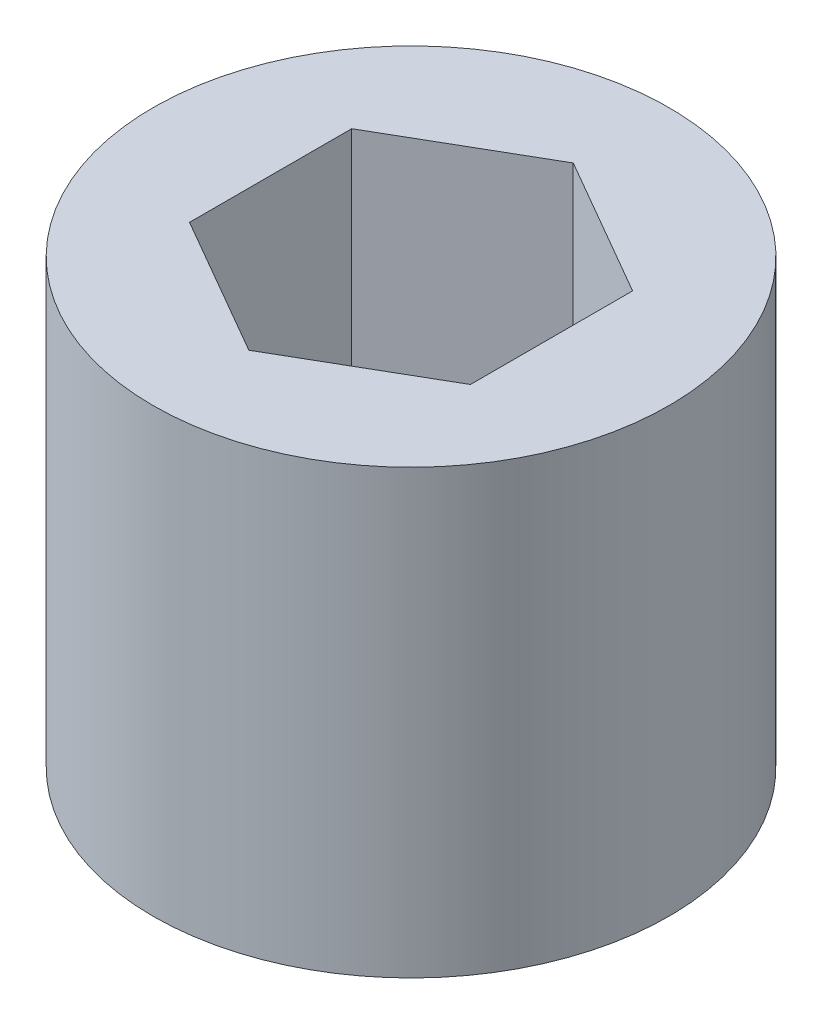
ISO-10303-21;
HEADER;
FILE_DESCRIPTION(('STEP AP214'),'2;1');
FILE_NAME('part.step','',(''),(''),'','','');
FILE_SCHEMA(('AUTOMOTIVE_DESIGN { 1 0 10303 214 1 1 1 1 }'));
ENDSEC;
DATA;
#1=APPLICATION_CONTEXT('core data for automotive mechanical design processes');
#2=APPLICATION_PROTOCOL_DEFINITION('international standard','automotive_design',2000,#1);
#3=PRODUCT_CONTEXT('',#1,'mechanical');
#4=PRODUCT('Part','Part','',(#3));
#5=PRODUCT_RELATED_PRODUCT_CATEGORY('part','',(#4));
#6=PRODUCT_DEFINITION_FORMATION('','',#4);
#7=PRODUCT_DEFINITION_CONTEXT('part definition',#1,'design');
#8=PRODUCT_DEFINITION('design','',#6,#7);
#9=PRODUCT_DEFINITION_SHAPE('','',#8);
#10=(LENGTH_UNIT() NAMED_UNIT(*) SI_UNIT(.MILLI.,.METRE.));
#11=(NAMED_UNIT(*) PLANE_ANGLE_UNIT() SI_UNIT($,.RADIAN.));
#12=(NAMED_UNIT(*) SI_UNIT($,.STERADIAN.) SOLID_ANGLE_UNIT());
#13=UNCERTAINTY_MEASURE_WITH_UNIT(LENGTH_MEASURE(1.E-05),#10,'distance_accuracy_value','');
#14=(GEOMETRIC_REPRESENTATION_CONTEXT(3) GLOBAL_UNCERTAINTY_ASSIGNED_CONTEXT((#13)) GLOBAL_UNIT_ASSIGNED_CONTEXT((#10,
#11,#12)) REPRESENTATION_CONTEXT('',''));
#15=CARTESIAN_POINT('',(0.,0.,0.));
#16=DIRECTION('',(0.,0.,1.));
#17=DIRECTION('',(1.,0.,0.));
#18=AXIS2_PLACEMENT_3D('',#15,#16,#17);
#19=CARTESIAN_POINT('',(0.,2.032,0.));
#20=DIRECTION('',(0.,1.,0.));
#21=DIRECTION('',(0.,0.,1.));
#22=AXIS2_PLACEMENT_3D('',#19,#20,#21);
#23=PLANE('',#22);
#24=DIRECTION('',(0.,0.,1.));
#25=VECTOR('',#24,1.);
#26=CARTESIAN_POINT('',(2.16567497817377,2.032,-16.034004));
#27=LINE('',#26,#25);
#28=CARTESIAN_POINT('',(2.16567497817377,2.032,1.25035303162645));
#29=VERTEX_POINT('',#28);
#30=CARTESIAN_POINT('',(2.1656749781745,2.032,-1.25035303162447));
#31=VERTEX_POINT('',#30);
#32=EDGE_CURVE('E84',#29,#31,#27,.F.);
#33=ORIENTED_EDGE('',*,*,#32,.T.);
#34=DIRECTION('',(0.866025403784429,0.,0.500000000000017));
#35=VECTOR('',#34,1.);
#36=CARTESIAN_POINT('',(-16.0340039999993,2.032,-11.7579425888392));
#37=LINE('',#36,#35);
#38=CARTESIAN_POINT('',(-1.34094124693007E-12,2.032,-2.50070606325096));
#39=VERTEX_POINT('',#38);
#40=EDGE_CURVE('E86',#31,#39,#37,.F.);
#41=ORIENTED_EDGE('',*,*,#40,.T.);
#42=DIRECTION('',(0.866025403784429,0.,-0.500000000000017));
#43=VECTOR('',#42,1.);
#44=CARTESIAN_POINT('',(-16.0340039999995,2.032,6.7565304623359));
#45=LINE('',#44,#43);
#46=CARTESIAN_POINT('',(-2.16567497817377,2.032,-1.25035303162645));
#47=VERTEX_POINT('',#46);
#48=EDGE_CURVE('E127',#39,#47,#45,.F.);
#49=ORIENTED_EDGE('',*,*,#48,.T.);
#50=DIRECTION('',(0.,0.,-1.));
#51=VECTOR('',#50,1.);
#52=CARTESIAN_POINT('',(-2.16567497817377,2.032,16.034004));
#53=LINE('',#52,#51);
#54=CARTESIAN_POINT('',(-2.16567497817377,2.032,1.25035303162502));
#55=VERTEX_POINT('',#54);
#56=EDGE_CURVE('E130',#47,#55,#53,.F.);
#57=ORIENTED_EDGE('',*,*,#56,.T.);
#58=DIRECTION('',(-0.866025403784429,0.,-0.500000000000017));
#59=VECTOR('',#58,1.);
#60=CARTESIAN_POINT('',(16.0340039999992,2.032,11.7579425888394));
#61=LINE('',#60,#59);
#62=CARTESIAN_POINT('',(2.61422827829705E-12,2.032,2.50070606325182));
#63=VERTEX_POINT('',#62);
#64=EDGE_CURVE('E108',#55,#63,#61,.F.);
#65=ORIENTED_EDGE('',*,*,#64,.T.);
#66=DIRECTION('',(-0.866025403784429,0.,0.500000000000017));
#67=VECTOR('',#66,1.);
#68=CARTESIAN_POINT('',(16.0340039999995,2.032,-6.7565304623359));
#69=LINE('',#68,#67);
#70=EDGE_CURVE('E89',#63,#29,#69,.F.);
#71=ORIENTED_EDGE('',*,*,#70,.T.);
#72=EDGE_LOOP('',(#33,#41,#49,#57,#65,#71));
#73=FACE_BOUND('',#72,.T.);
#74=ADVANCED_FACE('F16',(#73),#23,.T.);
#75=CARTESIAN_POINT('',(-16.034004,2.286,-11.7579425888379));
#76=DIRECTION('',(0.866025403784429,0.,0.500000000000017));
#77=DIRECTION('',(0.500000000000017,0.,-0.866025403784429));
#78=AXIS2_PLACEMENT_3D('',#75,#76,#77);
#79=CYLINDRICAL_SURFACE('',#78,0.254);
#80=DIRECTION('',(-0.866025403784429,0.,-0.500000000000017));
#81=VECTOR('',#80,1.);
#82=CARTESIAN_POINT('',(2.41967497817377,2.286,-1.397));
#83=LINE('',#82,#81);
#84=CARTESIAN_POINT('',(2.41967497817454,2.286,-1.39699999999955));
#85=VERTEX_POINT('',#84);
#86=CARTESIAN_POINT('',(-1.26878929640352E-12,2.286,-2.79400000000082));
#87=VERTEX_POINT('',#86);
#88=EDGE_CURVE('E115',#85,#87,#83,.T.);
#89=ORIENTED_EDGE('',*,*,#88,.T.);
#90=CARTESIAN_POINT('',(-2.61422827829705E-12,2.286,-2.50070606325148));
#91=DIRECTION('',(1.,0.,0.));
#92=DIRECTION('',(0.,0.,-1.));
#93=AXIS2_PLACEMENT_3D('',#90,#91,#92);
#94=ELLIPSE('',#93,0.293293936748333,0.254);
#95=EDGE_CURVE('E99',#87,#39,#94,.F.);
#96=ORIENTED_EDGE('',*,*,#95,.T.);
#97=ORIENTED_EDGE('',*,*,#40,.F.);
#98=CARTESIAN_POINT('',(2.16567497817377,2.286,-1.25035303162405));
#99=DIRECTION('',(0.499999999999992,0.,0.866025403784443));
#100=DIRECTION('',(0.866025403784444,0.,-0.499999999999992));
#101=AXIS2_PLACEMENT_3D('',#98,#99,#100);
#102=ELLIPSE('',#101,0.293293936748328,0.254);
#103=EDGE_CURVE('E19',#31,#85,#102,.T.);
#104=ORIENTED_EDGE('',*,*,#103,.T.);
#105=EDGE_LOOP('',(#89,#96,#97,#104));
#106=FACE_BOUND('',#105,.T.);
#107=ADVANCED_FACE('F96',(#106),#79,.F.);
#108=CARTESIAN_POINT('',(2.16567497817377,2.286,-16.034004));
#109=DIRECTION('',(0.,0.,1.));
#110=DIRECTION('',(1.,0.,0.));
#111=AXIS2_PLACEMENT_3D('',#108,#109,#110);
#112=CYLINDRICAL_SURFACE('',#111,0.254);
#113=ORIENTED_EDGE('',*,*,#32,.F.);
#114=CARTESIAN_POINT('',(2.16567497817377,2.286,1.25035303162707));
#115=DIRECTION('',(-0.499999999999992,0.,0.866025403784443));
#116=DIRECTION('',(-0.866025403784444,0.,-0.499999999999992));
#117=AXIS2_PLACEMENT_3D('',#114,#115,#116);
#118=ELLIPSE('',#117,0.293293936748328,0.254);
#119=CARTESIAN_POINT('',(2.41967497817319,2.286,1.3970000000009));
#120=VERTEX_POINT('',#119);
#121=EDGE_CURVE('E106',#29,#120,#118,.T.);
#122=ORIENTED_EDGE('',*,*,#121,.T.);
#123=DIRECTION('',(0.,0.,-1.));
#124=VECTOR('',#123,1.);
#125=CARTESIAN_POINT('',(2.41967497817377,2.286,1.397));
#126=LINE('',#125,#124);
#127=EDGE_CURVE('E104',#120,#85,#126,.T.);
#128=ORIENTED_EDGE('',*,*,#127,.T.);
#129=ORIENTED_EDGE('',*,*,#103,.F.);
#130=EDGE_LOOP('',(#113,#122,#128,#129));
#131=FACE_BOUND('',#130,.T.);
#132=ADVANCED_FACE('F102',(#131),#112,.F.);
#133=CARTESIAN_POINT('',(16.034004,2.286,-6.75653046233496));
#134=DIRECTION('',(-0.866025403784429,0.,0.500000000000017));
#135=DIRECTION('',(0.500000000000017,0.,0.866025403784429));
#136=AXIS2_PLACEMENT_3D('',#133,#134,#135);
#137=CYLINDRICAL_SURFACE('',#136,0.254);
#138=ORIENTED_EDGE('',*,*,#70,.F.);
#139=CARTESIAN_POINT('',(2.61422827829705E-12,2.286,2.50070606325148));
#140=DIRECTION('',(-1.,0.,0.));
#141=DIRECTION('',(0.,0.,1.));
#142=AXIS2_PLACEMENT_3D('',#139,#140,#141);
#143=ELLIPSE('',#142,0.293293936748333,0.254);
#144=CARTESIAN_POINT('',(1.26878929640352E-12,2.286,2.79400000000082));
#145=VERTEX_POINT('',#144);
#146=EDGE_CURVE('E131',#63,#145,#143,.T.);
#147=ORIENTED_EDGE('',*,*,#146,.T.);
#148=DIRECTION('',(0.866025403784429,0.,-0.500000000000017));
#149=VECTOR('',#148,1.);
#150=CARTESIAN_POINT('',(0.,2.286,2.794));
#151=LINE('',#150,#149);
#152=EDGE_CURVE('E118',#145,#120,#151,.T.);
#153=ORIENTED_EDGE('',*,*,#152,.T.);
#154=ORIENTED_EDGE('',*,*,#121,.F.);
#155=EDGE_LOOP('',(#138,#147,#153,#154));
#156=FACE_BOUND('',#155,.T.);
#157=ADVANCED_FACE('F143',(#156),#137,.F.);
#158=CARTESIAN_POINT('',(16.034004,2.286,11.7579425888379));
#159=DIRECTION('',(-0.866025403784429,0.,-0.500000000000017));
#160=DIRECTION('',(-0.500000000000017,0.,0.866025403784429));
#161=AXIS2_PLACEMENT_3D('',#158,#159,#160);
#162=CYLINDRICAL_SURFACE('',#161,0.254);
#163=ORIENTED_EDGE('',*,*,#64,.F.);
#164=CARTESIAN_POINT('',(-2.16567497817377,2.286,1.25035303162405));
#165=DIRECTION('',(-0.499999999999992,0.,-0.866025403784443));
#166=DIRECTION('',(-0.866025403784444,0.,0.499999999999992));
#167=AXIS2_PLACEMENT_3D('',#164,#165,#166);
#168=ELLIPSE('',#167,0.293293936748328,0.254);
#169=CARTESIAN_POINT('',(-2.41967497817454,2.286,1.39699999999955));
#170=VERTEX_POINT('',#169);
#171=EDGE_CURVE('E128',#55,#170,#168,.T.);
#172=ORIENTED_EDGE('',*,*,#171,.T.);
#173=DIRECTION('',(0.866025403784429,0.,0.500000000000017));
#174=VECTOR('',#173,1.);
#175=CARTESIAN_POINT('',(-2.41967497817377,2.286,1.397));
#176=LINE('',#175,#174);
#177=EDGE_CURVE('E117',#170,#145,#176,.T.);
#178=ORIENTED_EDGE('',*,*,#177,.T.);
#179=ORIENTED_EDGE('',*,*,#146,.F.);
#180=EDGE_LOOP('',(#163,#172,#178,#179));
#181=FACE_BOUND('',#180,.T.);
#182=ADVANCED_FACE('F185',(#181),#162,.F.);
#183=CARTESIAN_POINT('',(-2.16567497817377,2.286,16.034004));
#184=DIRECTION('',(0.,0.,-1.));
#185=DIRECTION('',(-1.,0.,0.));
#186=AXIS2_PLACEMENT_3D('',#183,#184,#185);
#187=CYLINDRICAL_SURFACE('',#186,0.254);
#188=ORIENTED_EDGE('',*,*,#56,.F.);
#189=CARTESIAN_POINT('',(-2.16567497817377,2.286,-1.25035303162707));
#190=DIRECTION('',(0.499999999999992,0.,-0.866025403784443));
#191=DIRECTION('',(0.866025403784444,0.,0.499999999999992));
#192=AXIS2_PLACEMENT_3D('',#189,#190,#191);
#193=ELLIPSE('',#192,0.293293936748328,0.254);
#194=CARTESIAN_POINT('',(-2.41967497817319,2.286,-1.3970000000009));
#195=VERTEX_POINT('',#194);
#196=EDGE_CURVE('E125',#47,#195,#193,.T.);
#197=ORIENTED_EDGE('',*,*,#196,.T.);
#198=DIRECTION('',(0.,0.,1.));
#199=VECTOR('',#198,1.);
#200=CARTESIAN_POINT('',(-2.41967497817377,2.286,-1.397));
#201=LINE('',#200,#199);
#202=EDGE_CURVE('E180',#195,#170,#201,.T.);
#203=ORIENTED_EDGE('',*,*,#202,.T.);
#204=ORIENTED_EDGE('',*,*,#171,.F.);
#205=EDGE_LOOP('',(#188,#197,#203,#204));
#206=FACE_BOUND('',#205,.T.);
#207=ADVANCED_FACE('F205',(#206),#187,.F.);
#208=CARTESIAN_POINT('',(-16.034004,2.286,6.75653046233496));
#209=DIRECTION('',(0.866025403784429,0.,-0.500000000000017));
#210=DIRECTION('',(-0.500000000000017,0.,-0.866025403784429));
#211=AXIS2_PLACEMENT_3D('',#208,#209,#210);
#212=CYLINDRICAL_SURFACE('',#211,0.254);
#213=DIRECTION('',(-0.866025403784429,0.,0.500000000000017));
#214=VECTOR('',#213,1.);
#215=CARTESIAN_POINT('',(0.,2.286,-2.794));
#216=LINE('',#215,#214);
#217=EDGE_CURVE('E177',#87,#195,#216,.T.);
#218=ORIENTED_EDGE('',*,*,#217,.T.);
#219=ORIENTED_EDGE('',*,*,#196,.F.);
#220=ORIENTED_EDGE('',*,*,#48,.F.);
#221=ORIENTED_EDGE('',*,*,#95,.F.);
#222=EDGE_LOOP('',(#218,#219,#220,#221));
#223=FACE_BOUND('',#222,.T.);
#224=ADVANCED_FACE('F201',(#223),#212,.F.);
#225=CARTESIAN_POINT('',(2.41967497817377,7.62,-1.397));
#226=DIRECTION('',(0.500000000000017,0.,-0.866025403784429));
#227=DIRECTION('',(-0.866025403784429,0.,-0.500000000000017));
#228=AXIS2_PLACEMENT_3D('',#225,#226,#227);
#229=PLANE('',#228);
#230=DIRECTION('',(0.866025403784443,0.,0.499999999999993));
#231=VECTOR('',#230,1.);
#232=CARTESIAN_POINT('',(0.,7.62,-2.794));
#233=LINE('',#232,#231);
#234=CARTESIAN_POINT('',(0.,7.62,-2.79400000000003));
#235=VERTEX_POINT('',#234);
#236=CARTESIAN_POINT('',(2.41967497817377,7.62,-1.397));
#237=VERTEX_POINT('',#236);
#238=EDGE_CURVE('E167',#235,#237,#233,.T.);
#239=ORIENTED_EDGE('',*,*,#238,.F.);
#240=DIRECTION('',(0.,1.,0.));
#241=VECTOR('',#240,1.);
#242=CARTESIAN_POINT('',(0.,7.62,-2.794));
#243=LINE('',#242,#241);
#244=EDGE_CURVE('E169',#235,#87,#243,.F.);
#245=ORIENTED_EDGE('',*,*,#244,.T.);
#246=ORIENTED_EDGE('',*,*,#88,.F.);
#247=DIRECTION('',(0.,1.,0.));
#248=VECTOR('',#247,1.);
#249=CARTESIAN_POINT('',(2.41967497817377,7.62,-1.397));
#250=LINE('',#249,#248);
#251=EDGE_CURVE('E114',#85,#237,#250,.T.);
#252=ORIENTED_EDGE('',*,*,#251,.T.);
#253=EDGE_LOOP('',(#239,#245,#246,#252));
#254=FACE_BOUND('',#253,.T.);
#255=ADVANCED_FACE('F199',(#254),#229,.F.);
#256=CARTESIAN_POINT('',(2.41967497817377,7.62,1.397));
#257=DIRECTION('',(1.,0.,0.));
#258=DIRECTION('',(0.,0.,-1.));
#259=AXIS2_PLACEMENT_3D('',#256,#257,#258);
#260=PLANE('',#259);
#261=DIRECTION('',(0.,0.,1.));
#262=VECTOR('',#261,1.);
#263=CARTESIAN_POINT('',(2.41967497817377,7.62,0.));
#264=LINE('',#263,#262);
#265=CARTESIAN_POINT('',(2.41967497817376,7.62,1.39699999999998));
#266=VERTEX_POINT('',#265);
#267=EDGE_CURVE('E160',#237,#266,#264,.T.);
#268=ORIENTED_EDGE('',*,*,#267,.F.);
#269=ORIENTED_EDGE('',*,*,#251,.F.);
#270=ORIENTED_EDGE('',*,*,#127,.F.);
#271=DIRECTION('',(0.,1.,0.));
#272=VECTOR('',#271,1.);
#273=CARTESIAN_POINT('',(2.41967497817373,7.62,1.39699999999993));
#274=LINE('',#273,#272);
#275=EDGE_CURVE('E116',#120,#266,#274,.T.);
#276=ORIENTED_EDGE('',*,*,#275,.T.);
#277=EDGE_LOOP('',(#268,#269,#270,#276));
#278=FACE_BOUND('',#277,.T.);
#279=ADVANCED_FACE('F150',(#278),#260,.F.);
#280=CARTESIAN_POINT('',(0.,7.62,2.794));
#281=DIRECTION('',(0.500000000000017,0.,0.866025403784429));
#282=DIRECTION('',(0.866025403784429,0.,-0.500000000000017));
#283=AXIS2_PLACEMENT_3D('',#280,#281,#282);
#284=PLANE('',#283);
#285=DIRECTION('',(-0.866025403784443,0.,0.499999999999993));
#286=VECTOR('',#285,1.);
#287=CARTESIAN_POINT('',(2.41967497817377,7.62,1.397));
#288=LINE('',#287,#286);
#289=CARTESIAN_POINT('',(0.,7.62,2.79400000000002));
#290=VERTEX_POINT('',#289);
#291=EDGE_CURVE('E154',#266,#290,#288,.T.);
#292=ORIENTED_EDGE('',*,*,#291,.F.);
#293=ORIENTED_EDGE('',*,*,#275,.F.);
#294=ORIENTED_EDGE('',*,*,#152,.F.);
#295=DIRECTION('',(0.,1.,0.));
#296=VECTOR('',#295,1.);
#297=CARTESIAN_POINT('',(0.,7.62,2.79400000000007));
#298=LINE('',#297,#296);
#299=EDGE_CURVE('E111',#145,#290,#298,.T.);
#300=ORIENTED_EDGE('',*,*,#299,.T.);
#301=EDGE_LOOP('',(#292,#293,#294,#300));
#302=FACE_BOUND('',#301,.T.);
#303=ADVANCED_FACE('F152',(#302),#284,.F.);
#304=CARTESIAN_POINT('',(-2.41967497817377,7.62,1.397));
#305=DIRECTION('',(-0.500000000000017,0.,0.866025403784429));
#306=DIRECTION('',(0.866025403784429,0.,0.500000000000017));
#307=AXIS2_PLACEMENT_3D('',#304,#305,#306);
#308=PLANE('',#307);
#309=DIRECTION('',(-0.866025403784443,0.,-0.499999999999993));
#310=VECTOR('',#309,1.);
#311=CARTESIAN_POINT('',(0.,7.62,2.794));
#312=LINE('',#311,#310);
#313=CARTESIAN_POINT('',(-2.41967497817377,7.62,1.397));
#314=VERTEX_POINT('',#313);
#315=EDGE_CURVE('E159',#290,#314,#312,.T.);
#316=ORIENTED_EDGE('',*,*,#315,.F.);
#317=ORIENTED_EDGE('',*,*,#299,.F.);
#318=ORIENTED_EDGE('',*,*,#177,.F.);
#319=DIRECTION('',(0.,1.,0.));
#320=VECTOR('',#319,1.);
#321=CARTESIAN_POINT('',(-2.41967497817377,7.62,1.397));
#322=LINE('',#321,#320);
#323=EDGE_CURVE('E140',#170,#314,#322,.T.);
#324=ORIENTED_EDGE('',*,*,#323,.T.);
#325=EDGE_LOOP('',(#316,#317,#318,#324));
#326=FACE_BOUND('',#325,.T.);
#327=ADVANCED_FACE('F189',(#326),#308,.F.);
#328=CARTESIAN_POINT('',(-2.41967497817377,7.62,-1.397));
#329=DIRECTION('',(-1.,0.,0.));
#330=DIRECTION('',(0.,0.,1.));
#331=AXIS2_PLACEMENT_3D('',#328,#329,#330);
#332=PLANE('',#331);
#333=DIRECTION('',(0.,0.,1.));
#334=VECTOR('',#333,1.);
#335=CARTESIAN_POINT('',(-2.41967497817377,7.62,0.));
#336=LINE('',#335,#334);
#337=CARTESIAN_POINT('',(-2.41967497817376,7.62,-1.39699999999998));
#338=VERTEX_POINT('',#337);
#339=EDGE_CURVE('E191',#314,#338,#336,.F.);
#340=ORIENTED_EDGE('',*,*,#339,.F.);
#341=ORIENTED_EDGE('',*,*,#323,.F.);
#342=ORIENTED_EDGE('',*,*,#202,.F.);
#343=DIRECTION('',(0.,1.,0.));
#344=VECTOR('',#343,1.);
#345=CARTESIAN_POINT('',(-2.41967497817373,7.62,-1.39699999999993));
#346=LINE('',#345,#344);
#347=EDGE_CURVE('E34',#195,#338,#346,.T.);
#348=ORIENTED_EDGE('',*,*,#347,.T.);
#349=EDGE_LOOP('',(#340,#341,#342,#348));
#350=FACE_BOUND('',#349,.T.);
#351=ADVANCED_FACE('F190',(#350),#332,.F.);
#352=CARTESIAN_POINT('',(0.,7.62,-2.794));
#353=DIRECTION('',(-0.500000000000017,0.,-0.866025403784429));
#354=DIRECTION('',(-0.866025403784429,0.,0.500000000000017));
#355=AXIS2_PLACEMENT_3D('',#352,#353,#354);
#356=PLANE('',#355);
#357=DIRECTION('',(0.866025403784443,0.,-0.499999999999993));
#358=VECTOR('',#357,1.);
#359=CARTESIAN_POINT('',(-2.41967497817377,7.62,-1.397));
#360=LINE('',#359,#358);
#361=EDGE_CURVE('E123',#338,#235,#360,.T.);
#362=ORIENTED_EDGE('',*,*,#361,.F.);
#363=ORIENTED_EDGE('',*,*,#347,.F.);
#364=ORIENTED_EDGE('',*,*,#217,.F.);
#365=ORIENTED_EDGE('',*,*,#244,.F.);
#366=EDGE_LOOP('',(#362,#363,#364,#365));
#367=FACE_BOUND('',#366,.T.);
#368=ADVANCED_FACE('F196',(#367),#356,.F.);
#369=CARTESIAN_POINT('',(0.,7.62,0.));
#370=DIRECTION('',(0.,1.,0.));
#371=DIRECTION('',(0.,0.,1.));
#372=AXIS2_PLACEMENT_3D('',#369,#370,#371);
#373=PLANE('',#372);
#374=ORIENTED_EDGE('',*,*,#339,.T.);
#375=ORIENTED_EDGE('',*,*,#361,.T.);
#376=ORIENTED_EDGE('',*,*,#238,.T.);
#377=ORIENTED_EDGE('',*,*,#267,.T.);
#378=ORIENTED_EDGE('',*,*,#291,.T.);
#379=ORIENTED_EDGE('',*,*,#315,.T.);
#380=EDGE_LOOP('',(#374,#375,#376,#377,#378,#379));
#381=FACE_BOUND('',#380,.T.);
#382=CARTESIAN_POINT('',(0.,7.62,0.));
#383=DIRECTION('',(0.,1.,0.));
#384=DIRECTION('',(0.,0.,1.));
#385=AXIS2_PLACEMENT_3D('',#382,#383,#384);
#386=CIRCLE('',#385,4.445);
#387=CARTESIAN_POINT('',(0.,7.62,4.445));
#388=VERTEX_POINT('',#387);
#389=EDGE_CURVE('E25',#388,#388,#386,.F.);
#390=ORIENTED_EDGE('',*,*,#389,.F.);
#391=EDGE_LOOP('',(#390));
#392=FACE_BOUND('',#391,.T.);
#393=ADVANCED_FACE('F164',(#381,#392),#373,.T.);
#394=CARTESIAN_POINT('',(0.,0.,0.));
#395=DIRECTION('',(0.,1.,0.));
#396=DIRECTION('',(0.,0.,1.));
#397=AXIS2_PLACEMENT_3D('',#394,#395,#396);
#398=PLANE('',#397);
#399=CARTESIAN_POINT('',(0.,0.,0.));
#400=DIRECTION('',(0.,1.,0.));
#401=DIRECTION('',(0.,0.,1.));
#402=AXIS2_PLACEMENT_3D('',#399,#400,#401);
#403=CIRCLE('',#402,4.445);
#404=CARTESIAN_POINT('',(0.,0.,4.445));
#405=VERTEX_POINT('',#404);
#406=EDGE_CURVE('E11',#405,#405,#403,.T.);
#407=ORIENTED_EDGE('',*,*,#406,.F.);
#408=EDGE_LOOP('',(#407));
#409=FACE_BOUND('',#408,.T.);
#410=ADVANCED_FACE('F217',(#409),#398,.F.);
#411=CARTESIAN_POINT('',(0.,0.,0.));
#412=DIRECTION('',(0.,1.,0.));
#413=DIRECTION('',(0.,0.,1.));
#414=AXIS2_PLACEMENT_3D('',#411,#412,#413);
#415=CYLINDRICAL_SURFACE('',#414,4.445);
#416=ORIENTED_EDGE('',*,*,#389,.T.);
#417=EDGE_LOOP('',(#416));
#418=FACE_BOUND('',#417,.T.);
#419=ORIENTED_EDGE('',*,*,#406,.T.);
#420=EDGE_LOOP('',(#419));
#421=FACE_BOUND('',#420,.T.);
#422=ADVANCED_FACE('F215',(#418,#421),#415,.T.);
#423=CLOSED_SHELL('',(#74,#107,#132,#157,#182,#207,#224,#255,#279,#303,#327,#351,#368,#393,#410,#422));
#424=MANIFOLD_SOLID_BREP('B1',#423);
#425=ADVANCED_BREP_SHAPE_REPRESENTATION('',(#18,#424),#14);
#426=SHAPE_DEFINITION_REPRESENTATION(#9,#425);
ENDSEC;
END-ISO-10303-21;
